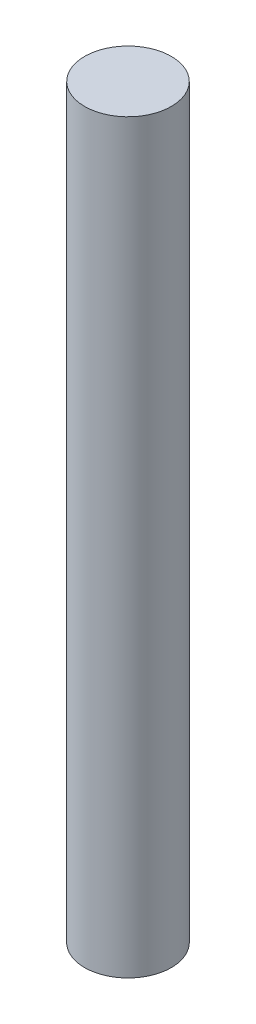
ISO-10303-21;
HEADER;
FILE_DESCRIPTION(('STEP AP214'),'2;1');
FILE_NAME('part.step','',(''),(''),'','','');
FILE_SCHEMA(('AUTOMOTIVE_DESIGN { 1 0 10303 214 1 1 1 1 }'));
ENDSEC;
DATA;
#1=APPLICATION_CONTEXT('core data for automotive mechanical design processes');
#2=APPLICATION_PROTOCOL_DEFINITION('international standard','automotive_design',2000,#1);
#3=PRODUCT_CONTEXT('',#1,'mechanical');
#4=PRODUCT('Part','Part','',(#3));
#5=PRODUCT_RELATED_PRODUCT_CATEGORY('part','',(#4));
#6=PRODUCT_DEFINITION_FORMATION('','',#4);
#7=PRODUCT_DEFINITION_CONTEXT('part definition',#1,'design');
#8=PRODUCT_DEFINITION('design','',#6,#7);
#9=PRODUCT_DEFINITION_SHAPE('','',#8);
#10=(LENGTH_UNIT() NAMED_UNIT(*) SI_UNIT(.MILLI.,.METRE.));
#11=(NAMED_UNIT(*) PLANE_ANGLE_UNIT() SI_UNIT($,.RADIAN.));
#12=(NAMED_UNIT(*) SI_UNIT($,.STERADIAN.) SOLID_ANGLE_UNIT());
#13=UNCERTAINTY_MEASURE_WITH_UNIT(LENGTH_MEASURE(1.E-05),#10,'distance_accuracy_value','');
#14=(GEOMETRIC_REPRESENTATION_CONTEXT(3) GLOBAL_UNCERTAINTY_ASSIGNED_CONTEXT((#13)) GLOBAL_UNIT_ASSIGNED_CONTEXT((#10,
#11,#12)) REPRESENTATION_CONTEXT('',''));
#15=CARTESIAN_POINT('',(0.,0.,0.));
#16=DIRECTION('',(0.,0.,1.));
#17=DIRECTION('',(1.,0.,0.));
#18=AXIS2_PLACEMENT_3D('',#15,#16,#17);
#19=CARTESIAN_POINT('',(0.,43.,0.));
#20=DIRECTION('',(0.,-1.,0.));
#21=DIRECTION('',(0.,0.,-1.));
#22=AXIS2_PLACEMENT_3D('',#19,#20,#21);
#23=CYLINDRICAL_SURFACE('',#22,2.5);
#24=CARTESIAN_POINT('',(0.,43.,0.));
#25=DIRECTION('',(0.,1.,0.));
#26=DIRECTION('',(0.,0.,1.));
#27=AXIS2_PLACEMENT_3D('',#24,#25,#26);
#28=CIRCLE('',#27,2.5);
#29=CARTESIAN_POINT('',(0.,43.,2.5));
#30=VERTEX_POINT('',#29);
#31=EDGE_CURVE('E10',#30,#30,#28,.T.);
#32=ORIENTED_EDGE('',*,*,#31,.F.);
#33=EDGE_LOOP('',(#32));
#34=FACE_BOUND('',#33,.T.);
#35=CARTESIAN_POINT('',(0.,0.,0.));
#36=DIRECTION('',(0.,1.,0.));
#37=DIRECTION('',(0.,0.,1.));
#38=AXIS2_PLACEMENT_3D('',#35,#36,#37);
#39=CIRCLE('',#38,2.5);
#40=CARTESIAN_POINT('',(0.,0.,2.5));
#41=VERTEX_POINT('',#40);
#42=EDGE_CURVE('E36',#41,#41,#39,.T.);
#43=ORIENTED_EDGE('',*,*,#42,.T.);
#44=EDGE_LOOP('',(#43));
#45=FACE_BOUND('',#44,.T.);
#46=ADVANCED_FACE('F33',(#34,#45),#23,.T.);
#47=CARTESIAN_POINT('',(0.,43.,0.));
#48=DIRECTION('',(0.,1.,0.));
#49=DIRECTION('',(0.,0.,1.));
#50=AXIS2_PLACEMENT_3D('',#47,#48,#49);
#51=PLANE('',#50);
#52=ORIENTED_EDGE('',*,*,#31,.T.);
#53=EDGE_LOOP('',(#52));
#54=FACE_BOUND('',#53,.T.);
#55=ADVANCED_FACE('F48',(#54),#51,.T.);
#56=CARTESIAN_POINT('',(0.,0.,0.));
#57=DIRECTION('',(0.,1.,0.));
#58=DIRECTION('',(0.,0.,1.));
#59=AXIS2_PLACEMENT_3D('',#56,#57,#58);
#60=PLANE('',#59);
#61=ORIENTED_EDGE('',*,*,#42,.F.);
#62=EDGE_LOOP('',(#61));
#63=FACE_BOUND('',#62,.T.);
#64=ADVANCED_FACE('F46',(#63),#60,.F.);
#65=CLOSED_SHELL('',(#46,#55,#64));
#66=MANIFOLD_SOLID_BREP('B2',#65);
#67=ADVANCED_BREP_SHAPE_REPRESENTATION('',(#18,#66),#14);
#68=SHAPE_DEFINITION_REPRESENTATION(#9,#67);
ENDSEC;
END-ISO-10303-21;
